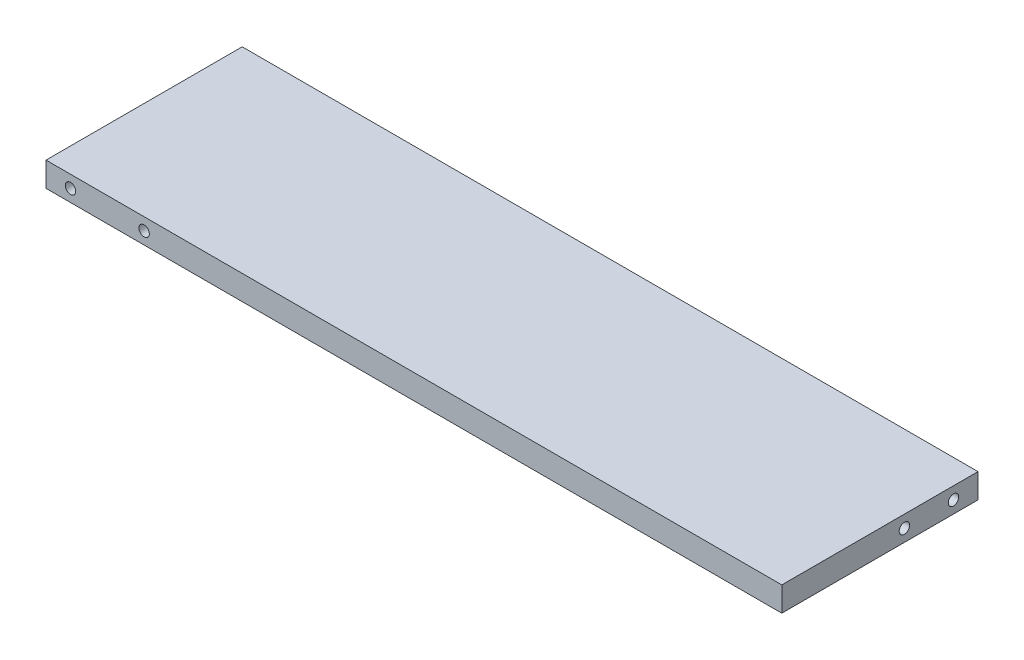
ISO-10303-21;
HEADER;
FILE_DESCRIPTION(('STEP AP214'),'2;1');
FILE_NAME('part.step','',(''),(''),'','','');
FILE_SCHEMA(('AUTOMOTIVE_DESIGN { 1 0 10303 214 1 1 1 1 }'));
ENDSEC;
DATA;
#1=APPLICATION_CONTEXT('core data for automotive mechanical design processes');
#2=APPLICATION_PROTOCOL_DEFINITION('international standard','automotive_design',2000,#1);
#3=PRODUCT_CONTEXT('',#1,'mechanical');
#4=PRODUCT('Part','Part','',(#3));
#5=PRODUCT_RELATED_PRODUCT_CATEGORY('part','',(#4));
#6=PRODUCT_DEFINITION_FORMATION('','',#4);
#7=PRODUCT_DEFINITION_CONTEXT('part definition',#1,'design');
#8=PRODUCT_DEFINITION('design','',#6,#7);
#9=PRODUCT_DEFINITION_SHAPE('','',#8);
#10=(LENGTH_UNIT() NAMED_UNIT(*) SI_UNIT(.MILLI.,.METRE.));
#11=(NAMED_UNIT(*) PLANE_ANGLE_UNIT() SI_UNIT($,.RADIAN.));
#12=(NAMED_UNIT(*) SI_UNIT($,.STERADIAN.) SOLID_ANGLE_UNIT());
#13=UNCERTAINTY_MEASURE_WITH_UNIT(LENGTH_MEASURE(1.E-05),#10,'distance_accuracy_value','');
#14=(GEOMETRIC_REPRESENTATION_CONTEXT(3) GLOBAL_UNCERTAINTY_ASSIGNED_CONTEXT((#13)) GLOBAL_UNIT_ASSIGNED_CONTEXT((#10,
#11,#12)) REPRESENTATION_CONTEXT('',''));
#15=CARTESIAN_POINT('',(0.,0.,0.));
#16=DIRECTION('',(0.,0.,1.));
#17=DIRECTION('',(1.,0.,0.));
#18=AXIS2_PLACEMENT_3D('',#15,#16,#17);
#19=CARTESIAN_POINT('',(95.25,3.175,25.4));
#20=DIRECTION('',(-1.,0.,0.));
#21=DIRECTION('',(0.,0.,1.));
#22=AXIS2_PLACEMENT_3D('',#19,#20,#21);
#23=PLANE('',#22);
#24=CARTESIAN_POINT('',(95.25,4.46864767411626E-12,-6.34999999999989));
#25=DIRECTION('',(1.,0.,0.));
#26=DIRECTION('',(0.,0.,-1.));
#27=AXIS2_PLACEMENT_3D('',#24,#25,#26);
#28=CIRCLE('',#27,1.35254999999999);
#29=CARTESIAN_POINT('',(95.25,4.46864767411626E-12,-7.70254999999988));
#30=VERTEX_POINT('',#29);
#31=EDGE_CURVE('E109',#30,#30,#28,.T.);
#32=ORIENTED_EDGE('',*,*,#31,.F.);
#33=EDGE_LOOP('',(#32));
#34=FACE_BOUND('',#33,.T.);
#35=CARTESIAN_POINT('',(95.25,4.46864767411626E-12,-19.0499999999999));
#36=DIRECTION('',(1.,0.,0.));
#37=DIRECTION('',(0.,0.,-1.));
#38=AXIS2_PLACEMENT_3D('',#35,#36,#37);
#39=CIRCLE('',#38,1.35254999999999);
#40=CARTESIAN_POINT('',(95.25,4.46864767411626E-12,-20.4025499999999));
#41=VERTEX_POINT('',#40);
#42=EDGE_CURVE('E108',#41,#41,#39,.T.);
#43=ORIENTED_EDGE('',*,*,#42,.F.);
#44=EDGE_LOOP('',(#43));
#45=FACE_BOUND('',#44,.T.);
#46=DIRECTION('',(0.,0.,-1.));
#47=VECTOR('',#46,1.);
#48=CARTESIAN_POINT('',(95.25,-3.175,25.4));
#49=LINE('',#48,#47);
#50=CARTESIAN_POINT('',(95.25,-3.175,25.4));
#51=VERTEX_POINT('',#50);
#52=CARTESIAN_POINT('',(95.25,-3.175,-25.4));
#53=VERTEX_POINT('',#52);
#54=EDGE_CURVE('E131',#51,#53,#49,.T.);
#55=ORIENTED_EDGE('',*,*,#54,.T.);
#56=DIRECTION('',(0.,-1.,0.));
#57=VECTOR('',#56,1.);
#58=CARTESIAN_POINT('',(95.25,3.175,-25.4));
#59=LINE('',#58,#57);
#60=CARTESIAN_POINT('',(95.25,3.175,-25.4));
#61=VERTEX_POINT('',#60);
#62=EDGE_CURVE('E11',#61,#53,#59,.T.);
#63=ORIENTED_EDGE('',*,*,#62,.F.);
#64=DIRECTION('',(0.,0.,-1.));
#65=VECTOR('',#64,1.);
#66=CARTESIAN_POINT('',(95.25,3.175,25.4));
#67=LINE('',#66,#65);
#68=CARTESIAN_POINT('',(95.25,3.175,25.4));
#69=VERTEX_POINT('',#68);
#70=EDGE_CURVE('E132',#69,#61,#67,.T.);
#71=ORIENTED_EDGE('',*,*,#70,.F.);
#72=DIRECTION('',(0.,-1.,0.));
#73=VECTOR('',#72,1.);
#74=CARTESIAN_POINT('',(95.25,3.175,25.4));
#75=LINE('',#74,#73);
#76=EDGE_CURVE('E138',#69,#51,#75,.T.);
#77=ORIENTED_EDGE('',*,*,#76,.T.);
#78=EDGE_LOOP('',(#55,#63,#71,#77));
#79=FACE_BOUND('',#78,.T.);
#80=ADVANCED_FACE('F38',(#34,#45,#79),#23,.F.);
#81=CARTESIAN_POINT('',(-95.25,3.175,-25.4));
#82=DIRECTION('',(0.,0.,1.));
#83=DIRECTION('',(1.,0.,0.));
#84=AXIS2_PLACEMENT_3D('',#81,#82,#83);
#85=PLANE('',#84);
#86=DIRECTION('',(-1.,0.,0.));
#87=VECTOR('',#86,1.);
#88=CARTESIAN_POINT('',(-95.25,-3.175,-25.4));
#89=LINE('',#88,#87);
#90=CARTESIAN_POINT('',(-95.25,-3.175,-25.4));
#91=VERTEX_POINT('',#90);
#92=EDGE_CURVE('E141',#53,#91,#89,.T.);
#93=ORIENTED_EDGE('',*,*,#92,.T.);
#94=DIRECTION('',(0.,-1.,0.));
#95=VECTOR('',#94,1.);
#96=CARTESIAN_POINT('',(-95.25,3.175,-25.4));
#97=LINE('',#96,#95);
#98=CARTESIAN_POINT('',(-95.25,3.175,-25.4));
#99=VERTEX_POINT('',#98);
#100=EDGE_CURVE('E46',#99,#91,#97,.T.);
#101=ORIENTED_EDGE('',*,*,#100,.F.);
#102=DIRECTION('',(-1.,0.,0.));
#103=VECTOR('',#102,1.);
#104=CARTESIAN_POINT('',(-95.25,3.175,-25.4));
#105=LINE('',#104,#103);
#106=EDGE_CURVE('E85',#61,#99,#105,.T.);
#107=ORIENTED_EDGE('',*,*,#106,.F.);
#108=ORIENTED_EDGE('',*,*,#62,.T.);
#109=EDGE_LOOP('',(#93,#101,#107,#108));
#110=FACE_BOUND('',#109,.T.);
#111=ADVANCED_FACE('F166',(#110),#85,.F.);
#112=CARTESIAN_POINT('',(-95.25,3.175,25.4));
#113=DIRECTION('',(1.,0.,0.));
#114=DIRECTION('',(0.,0.,-1.));
#115=AXIS2_PLACEMENT_3D('',#112,#113,#114);
#116=PLANE('',#115);
#117=DIRECTION('',(0.,0.,1.));
#118=VECTOR('',#117,1.);
#119=CARTESIAN_POINT('',(-95.25,-3.175,25.4));
#120=LINE('',#119,#118);
#121=CARTESIAN_POINT('',(-95.25,-3.175,25.4));
#122=VERTEX_POINT('',#121);
#123=EDGE_CURVE('E72',#91,#122,#120,.T.);
#124=ORIENTED_EDGE('',*,*,#123,.T.);
#125=DIRECTION('',(0.,-1.,0.));
#126=VECTOR('',#125,1.);
#127=CARTESIAN_POINT('',(-95.25,3.175,25.4));
#128=LINE('',#127,#126);
#129=CARTESIAN_POINT('',(-95.25,3.175,25.4));
#130=VERTEX_POINT('',#129);
#131=EDGE_CURVE('E146',#130,#122,#128,.T.);
#132=ORIENTED_EDGE('',*,*,#131,.F.);
#133=DIRECTION('',(0.,0.,1.));
#134=VECTOR('',#133,1.);
#135=CARTESIAN_POINT('',(-95.25,3.175,25.4));
#136=LINE('',#135,#134);
#137=EDGE_CURVE('E135',#99,#130,#136,.T.);
#138=ORIENTED_EDGE('',*,*,#137,.F.);
#139=ORIENTED_EDGE('',*,*,#100,.T.);
#140=EDGE_LOOP('',(#124,#132,#138,#139));
#141=FACE_BOUND('',#140,.T.);
#142=ADVANCED_FACE('F148',(#141),#116,.F.);
#143=CARTESIAN_POINT('',(-95.25,3.175,25.4));
#144=DIRECTION('',(0.,0.,-1.));
#145=DIRECTION('',(-1.,0.,0.));
#146=AXIS2_PLACEMENT_3D('',#143,#144,#145);
#147=PLANE('',#146);
#148=CARTESIAN_POINT('',(-69.8500000000035,-4.01848693210027E-12,25.4));
#149=DIRECTION('',(0.,0.,1.));
#150=DIRECTION('',(1.,0.,0.));
#151=AXIS2_PLACEMENT_3D('',#148,#149,#150);
#152=CIRCLE('',#151,1.35254999999999);
#153=CARTESIAN_POINT('',(-68.4974500000036,-4.01848693210027E-12,25.4));
#154=VERTEX_POINT('',#153);
#155=EDGE_CURVE('E119',#154,#154,#152,.T.);
#156=ORIENTED_EDGE('',*,*,#155,.F.);
#157=EDGE_LOOP('',(#156));
#158=FACE_BOUND('',#157,.T.);
#159=CARTESIAN_POINT('',(-88.9000000000035,-4.4200754167889E-12,25.4));
#160=DIRECTION('',(0.,0.,1.));
#161=DIRECTION('',(1.,0.,0.));
#162=AXIS2_PLACEMENT_3D('',#159,#160,#161);
#163=CIRCLE('',#162,1.35254999999999);
#164=CARTESIAN_POINT('',(-87.5474500000035,-4.4200754167889E-12,25.4));
#165=VERTEX_POINT('',#164);
#166=EDGE_CURVE('E125',#165,#165,#163,.T.);
#167=ORIENTED_EDGE('',*,*,#166,.F.);
#168=EDGE_LOOP('',(#167));
#169=FACE_BOUND('',#168,.T.);
#170=DIRECTION('',(1.,0.,0.));
#171=VECTOR('',#170,1.);
#172=CARTESIAN_POINT('',(-95.25,-3.175,25.4));
#173=LINE('',#172,#171);
#174=EDGE_CURVE('E78',#122,#51,#173,.T.);
#175=ORIENTED_EDGE('',*,*,#174,.T.);
#176=ORIENTED_EDGE('',*,*,#76,.F.);
#177=DIRECTION('',(1.,0.,0.));
#178=VECTOR('',#177,1.);
#179=CARTESIAN_POINT('',(-95.25,3.175,25.4));
#180=LINE('',#179,#178);
#181=EDGE_CURVE('E54',#130,#69,#180,.T.);
#182=ORIENTED_EDGE('',*,*,#181,.F.);
#183=ORIENTED_EDGE('',*,*,#131,.T.);
#184=EDGE_LOOP('',(#175,#176,#182,#183));
#185=FACE_BOUND('',#184,.T.);
#186=ADVANCED_FACE('F155',(#158,#169,#185),#147,.F.);
#187=CARTESIAN_POINT('',(0.,3.175,0.));
#188=DIRECTION('',(0.,-1.,0.));
#189=DIRECTION('',(0.,0.,-1.));
#190=AXIS2_PLACEMENT_3D('',#187,#188,#189);
#191=PLANE('',#190);
#192=ORIENTED_EDGE('',*,*,#70,.T.);
#193=ORIENTED_EDGE('',*,*,#106,.T.);
#194=ORIENTED_EDGE('',*,*,#137,.T.);
#195=ORIENTED_EDGE('',*,*,#181,.T.);
#196=EDGE_LOOP('',(#192,#193,#194,#195));
#197=FACE_BOUND('',#196,.T.);
#198=ADVANCED_FACE('F157',(#197),#191,.F.);
#199=CARTESIAN_POINT('',(0.,-3.175,0.));
#200=DIRECTION('',(0.,-1.,0.));
#201=DIRECTION('',(0.,0.,-1.));
#202=AXIS2_PLACEMENT_3D('',#199,#200,#201);
#203=PLANE('',#202);
#204=ORIENTED_EDGE('',*,*,#54,.F.);
#205=ORIENTED_EDGE('',*,*,#174,.F.);
#206=ORIENTED_EDGE('',*,*,#123,.F.);
#207=ORIENTED_EDGE('',*,*,#92,.F.);
#208=EDGE_LOOP('',(#204,#205,#206,#207));
#209=FACE_BOUND('',#208,.T.);
#210=ADVANCED_FACE('F151',(#209),#203,.T.);
#211=CARTESIAN_POINT('',(-88.9000000000035,-4.4200754167889E-12,12.7));
#212=DIRECTION('',(0.,0.,1.));
#213=DIRECTION('',(1.,0.,0.));
#214=AXIS2_PLACEMENT_3D('',#211,#212,#213);
#215=CONICAL_SURFACE('',#214,1.35254999999999,1.02974425867665);
#216=CARTESIAN_POINT('',(-88.9000000000035,-4.4200754167889E-12,11.8873059697343));
#217=VERTEX_POINT('',#216);
#218=VERTEX_LOOP('',#217);
#219=FACE_BOUND('',#218,.T.);
#220=CARTESIAN_POINT('',(-88.9000000000035,-4.4200754167889E-12,12.7));
#221=DIRECTION('',(0.,0.,1.));
#222=DIRECTION('',(1.,0.,0.));
#223=AXIS2_PLACEMENT_3D('',#220,#221,#222);
#224=CIRCLE('',#223,1.35254999999999);
#225=CARTESIAN_POINT('',(-87.5474500000035,-4.4200754167889E-12,12.7));
#226=VERTEX_POINT('',#225);
#227=EDGE_CURVE('E128',#226,#226,#224,.T.);
#228=ORIENTED_EDGE('',*,*,#227,.T.);
#229=EDGE_LOOP('',(#228));
#230=FACE_BOUND('',#229,.T.);
#231=ADVANCED_FACE('F203',(#219,#230),#215,.F.);
#232=CARTESIAN_POINT('',(-88.9000000000035,-4.4200754167889E-12,25.4));
#233=DIRECTION('',(0.,0.,1.));
#234=DIRECTION('',(1.,0.,0.));
#235=AXIS2_PLACEMENT_3D('',#232,#233,#234);
#236=CYLINDRICAL_SURFACE('',#235,1.35254999999999);
#237=ORIENTED_EDGE('',*,*,#227,.F.);
#238=EDGE_LOOP('',(#237));
#239=FACE_BOUND('',#238,.T.);
#240=ORIENTED_EDGE('',*,*,#166,.T.);
#241=EDGE_LOOP('',(#240));
#242=FACE_BOUND('',#241,.T.);
#243=ADVANCED_FACE('F199',(#239,#242),#236,.F.);
#244=CARTESIAN_POINT('',(-69.8500000000035,-4.01848693210027E-12,12.7));
#245=DIRECTION('',(0.,0.,1.));
#246=DIRECTION('',(1.,0.,0.));
#247=AXIS2_PLACEMENT_3D('',#244,#245,#246);
#248=CONICAL_SURFACE('',#247,1.35254999999999,1.02974425867665);
#249=CARTESIAN_POINT('',(-69.8500000000035,-4.01848693210027E-12,11.8873059697343));
#250=VERTEX_POINT('',#249);
#251=VERTEX_LOOP('',#250);
#252=FACE_BOUND('',#251,.T.);
#253=CARTESIAN_POINT('',(-69.8500000000035,-4.01848693210027E-12,12.7));
#254=DIRECTION('',(0.,0.,1.));
#255=DIRECTION('',(1.,0.,0.));
#256=AXIS2_PLACEMENT_3D('',#253,#254,#255);
#257=CIRCLE('',#256,1.35254999999999);
#258=CARTESIAN_POINT('',(-68.4974500000036,-4.01848693210027E-12,12.7));
#259=VERTEX_POINT('',#258);
#260=EDGE_CURVE('E122',#259,#259,#257,.T.);
#261=ORIENTED_EDGE('',*,*,#260,.T.);
#262=EDGE_LOOP('',(#261));
#263=FACE_BOUND('',#262,.T.);
#264=ADVANCED_FACE('F195',(#252,#263),#248,.F.);
#265=CARTESIAN_POINT('',(-69.8500000000035,-4.01848693210027E-12,25.4));
#266=DIRECTION('',(0.,0.,1.));
#267=DIRECTION('',(1.,0.,0.));
#268=AXIS2_PLACEMENT_3D('',#265,#266,#267);
#269=CYLINDRICAL_SURFACE('',#268,1.35254999999999);
#270=ORIENTED_EDGE('',*,*,#260,.F.);
#271=EDGE_LOOP('',(#270));
#272=FACE_BOUND('',#271,.T.);
#273=ORIENTED_EDGE('',*,*,#155,.T.);
#274=EDGE_LOOP('',(#273));
#275=FACE_BOUND('',#274,.T.);
#276=ADVANCED_FACE('F187',(#272,#275),#269,.F.);
#277=CARTESIAN_POINT('',(81.026,4.46864767411626E-12,-19.0499999999999));
#278=DIRECTION('',(1.,0.,0.));
#279=DIRECTION('',(0.,0.,-1.));
#280=AXIS2_PLACEMENT_3D('',#277,#278,#279);
#281=CONICAL_SURFACE('',#280,1.35255,1.02974425867665);
#282=CARTESIAN_POINT('',(80.2133059697343,4.46496474627347E-12,-19.0499999999999));
#283=VERTEX_POINT('',#282);
#284=VERTEX_LOOP('',#283);
#285=FACE_BOUND('',#284,.T.);
#286=CARTESIAN_POINT('',(81.026,4.46864767411626E-12,-19.0499999999999));
#287=DIRECTION('',(1.,0.,0.));
#288=DIRECTION('',(0.,0.,-1.));
#289=AXIS2_PLACEMENT_3D('',#286,#287,#288);
#290=CIRCLE('',#289,1.35255);
#291=CARTESIAN_POINT('',(81.026,4.46864767411626E-12,-20.4025499999999));
#292=VERTEX_POINT('',#291);
#293=EDGE_CURVE('E112',#292,#292,#290,.T.);
#294=ORIENTED_EDGE('',*,*,#293,.T.);
#295=EDGE_LOOP('',(#294));
#296=FACE_BOUND('',#295,.T.);
#297=ADVANCED_FACE('F182',(#285,#296),#281,.F.);
#298=CARTESIAN_POINT('',(95.25,4.46864767411626E-12,-19.0499999999999));
#299=DIRECTION('',(1.,0.,0.));
#300=DIRECTION('',(0.,0.,-1.));
#301=AXIS2_PLACEMENT_3D('',#298,#299,#300);
#302=CYLINDRICAL_SURFACE('',#301,1.35254999999999);
#303=ORIENTED_EDGE('',*,*,#293,.F.);
#304=EDGE_LOOP('',(#303));
#305=FACE_BOUND('',#304,.T.);
#306=ORIENTED_EDGE('',*,*,#42,.T.);
#307=EDGE_LOOP('',(#306));
#308=FACE_BOUND('',#307,.T.);
#309=ADVANCED_FACE('F102',(#305,#308),#302,.F.);
#310=CARTESIAN_POINT('',(81.026,4.46864767411626E-12,-6.34999999999989));
#311=DIRECTION('',(1.,0.,0.));
#312=DIRECTION('',(0.,0.,-1.));
#313=AXIS2_PLACEMENT_3D('',#310,#311,#312);
#314=CONICAL_SURFACE('',#313,1.35255,1.02974425867665);
#315=CARTESIAN_POINT('',(80.2133059697343,4.46496474627347E-12,-6.34999999999989));
#316=VERTEX_POINT('',#315);
#317=VERTEX_LOOP('',#316);
#318=FACE_BOUND('',#317,.T.);
#319=CARTESIAN_POINT('',(81.026,4.46864767411626E-12,-6.34999999999989));
#320=DIRECTION('',(1.,0.,0.));
#321=DIRECTION('',(0.,0.,-1.));
#322=AXIS2_PLACEMENT_3D('',#319,#320,#321);
#323=CIRCLE('',#322,1.35255);
#324=CARTESIAN_POINT('',(81.026,4.46864767411626E-12,-7.70254999999989));
#325=VERTEX_POINT('',#324);
#326=EDGE_CURVE('E106',#325,#325,#323,.T.);
#327=ORIENTED_EDGE('',*,*,#326,.T.);
#328=EDGE_LOOP('',(#327));
#329=FACE_BOUND('',#328,.T.);
#330=ADVANCED_FACE('F98',(#318,#329),#314,.F.);
#331=CARTESIAN_POINT('',(95.25,4.46864767411626E-12,-6.34999999999989));
#332=DIRECTION('',(1.,0.,0.));
#333=DIRECTION('',(0.,0.,-1.));
#334=AXIS2_PLACEMENT_3D('',#331,#332,#333);
#335=CYLINDRICAL_SURFACE('',#334,1.35254999999999);
#336=ORIENTED_EDGE('',*,*,#326,.F.);
#337=EDGE_LOOP('',(#336));
#338=FACE_BOUND('',#337,.T.);
#339=ORIENTED_EDGE('',*,*,#31,.T.);
#340=EDGE_LOOP('',(#339));
#341=FACE_BOUND('',#340,.T.);
#342=ADVANCED_FACE('F101',(#338,#341),#335,.F.);
#343=CLOSED_SHELL('',(#80,#111,#142,#186,#198,#210,#231,#243,#264,#276,#297,#309,#330,#342));
#344=MANIFOLD_SOLID_BREP('B2',#343);
#345=ADVANCED_BREP_SHAPE_REPRESENTATION('',(#18,#344),#14);
#346=SHAPE_DEFINITION_REPRESENTATION(#9,#345);
ENDSEC;
END-ISO-10303-21;
